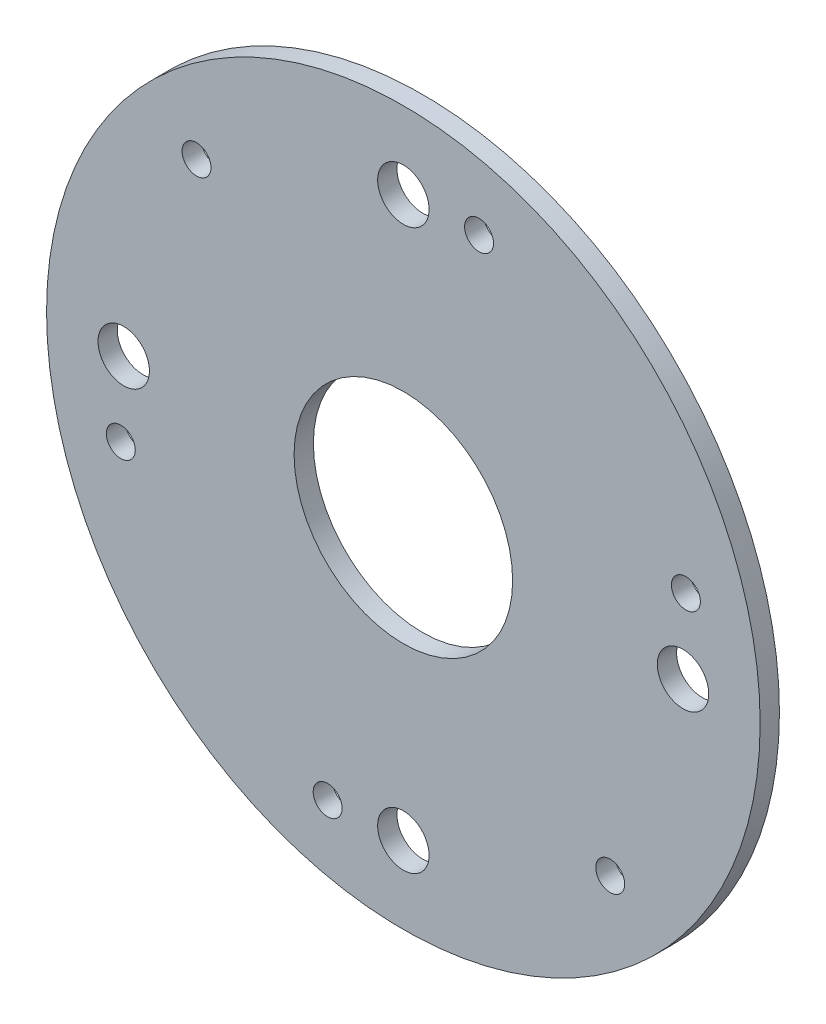
ISO-10303-21;
HEADER;
FILE_DESCRIPTION(('STEP AP214'),'2;1');
FILE_NAME('part.step','',(''),(''),'','','');
FILE_SCHEMA(('AUTOMOTIVE_DESIGN { 1 0 10303 214 1 1 1 1 }'));
ENDSEC;
DATA;
#1=APPLICATION_CONTEXT('core data for automotive mechanical design processes');
#2=APPLICATION_PROTOCOL_DEFINITION('international standard','automotive_design',2000,#1);
#3=PRODUCT_CONTEXT('',#1,'mechanical');
#4=PRODUCT('Part','Part','',(#3));
#5=PRODUCT_RELATED_PRODUCT_CATEGORY('part','',(#4));
#6=PRODUCT_DEFINITION_FORMATION('','',#4);
#7=PRODUCT_DEFINITION_CONTEXT('part definition',#1,'design');
#8=PRODUCT_DEFINITION('design','',#6,#7);
#9=PRODUCT_DEFINITION_SHAPE('','',#8);
#10=(LENGTH_UNIT() NAMED_UNIT(*) SI_UNIT(.MILLI.,.METRE.));
#11=(NAMED_UNIT(*) PLANE_ANGLE_UNIT() SI_UNIT($,.RADIAN.));
#12=(NAMED_UNIT(*) SI_UNIT($,.STERADIAN.) SOLID_ANGLE_UNIT());
#13=UNCERTAINTY_MEASURE_WITH_UNIT(LENGTH_MEASURE(1.E-05),#10,'distance_accuracy_value','');
#14=(GEOMETRIC_REPRESENTATION_CONTEXT(3) GLOBAL_UNCERTAINTY_ASSIGNED_CONTEXT((#13)) GLOBAL_UNIT_ASSIGNED_CONTEXT((#10,
#11,#12)) REPRESENTATION_CONTEXT('',''));
#15=CARTESIAN_POINT('',(0.,0.,0.));
#16=DIRECTION('',(0.,0.,1.));
#17=DIRECTION('',(1.,0.,0.));
#18=AXIS2_PLACEMENT_3D('',#15,#16,#17);
#19=CARTESIAN_POINT('',(0.,0.,47.5));
#20=DIRECTION('',(0.,0.,1.));
#21=DIRECTION('',(1.,0.,0.));
#22=AXIS2_PLACEMENT_3D('',#19,#20,#21);
#23=PLANE('',#22);
#24=CARTESIAN_POINT('',(43.5,0.,47.5));
#25=DIRECTION('',(0.,0.,1.));
#26=DIRECTION('',(1.,0.,0.));
#27=AXIS2_PLACEMENT_3D('',#24,#25,#26);
#28=CIRCLE('',#27,4.);
#29=CARTESIAN_POINT('',(47.5,0.,47.5));
#30=VERTEX_POINT('',#29);
#31=EDGE_CURVE('E64',#30,#30,#28,.T.);
#32=ORIENTED_EDGE('',*,*,#31,.F.);
#33=EDGE_LOOP('',(#32));
#34=FACE_BOUND('',#33,.T.);
#35=CARTESIAN_POINT('',(0.,43.5,47.5));
#36=DIRECTION('',(0.,0.,1.));
#37=DIRECTION('',(1.,0.,0.));
#38=AXIS2_PLACEMENT_3D('',#35,#36,#37);
#39=CIRCLE('',#38,4.);
#40=CARTESIAN_POINT('',(4.,43.5,47.5));
#41=VERTEX_POINT('',#40);
#42=EDGE_CURVE('E100',#41,#41,#39,.T.);
#43=ORIENTED_EDGE('',*,*,#42,.F.);
#44=EDGE_LOOP('',(#43));
#45=FACE_BOUND('',#44,.T.);
#46=CARTESIAN_POINT('',(-43.5,0.,47.5));
#47=DIRECTION('',(0.,0.,1.));
#48=DIRECTION('',(1.,0.,0.));
#49=AXIS2_PLACEMENT_3D('',#46,#47,#48);
#50=CIRCLE('',#49,4.);
#51=CARTESIAN_POINT('',(-39.5,0.,47.5));
#52=VERTEX_POINT('',#51);
#53=EDGE_CURVE('E96',#52,#52,#50,.T.);
#54=ORIENTED_EDGE('',*,*,#53,.F.);
#55=EDGE_LOOP('',(#54));
#56=FACE_BOUND('',#55,.T.);
#57=CARTESIAN_POINT('',(0.,-43.5,47.5));
#58=DIRECTION('',(0.,0.,1.));
#59=DIRECTION('',(1.,0.,0.));
#60=AXIS2_PLACEMENT_3D('',#57,#58,#59);
#61=CIRCLE('',#60,4.);
#62=CARTESIAN_POINT('',(3.99999999999999,-43.5,47.5));
#63=VERTEX_POINT('',#62);
#64=EDGE_CURVE('E92',#63,#63,#61,.T.);
#65=ORIENTED_EDGE('',*,*,#64,.F.);
#66=EDGE_LOOP('',(#65));
#67=FACE_BOUND('',#66,.T.);
#68=CARTESIAN_POINT('',(-11.7762665521647,-43.9496250961526,47.5));
#69=DIRECTION('',(0.,0.,1.));
#70=DIRECTION('',(1.,0.,0.));
#71=AXIS2_PLACEMENT_3D('',#68,#69,#70);
#72=CIRCLE('',#71,2.25);
#73=CARTESIAN_POINT('',(-9.52626655216473,-43.9496250961526,47.5));
#74=VERTEX_POINT('',#73);
#75=EDGE_CURVE('E87',#74,#74,#72,.T.);
#76=ORIENTED_EDGE('',*,*,#75,.F.);
#77=EDGE_LOOP('',(#76));
#78=FACE_BOUND('',#77,.T.);
#79=CARTESIAN_POINT('',(-43.9496250961526,-11.7762665521647,47.5));
#80=DIRECTION('',(0.,0.,1.));
#81=DIRECTION('',(1.,0.,0.));
#82=AXIS2_PLACEMENT_3D('',#79,#80,#81);
#83=CIRCLE('',#82,2.25);
#84=CARTESIAN_POINT('',(-41.6996250961526,-11.7762665521647,47.5));
#85=VERTEX_POINT('',#84);
#86=EDGE_CURVE('E83',#85,#85,#83,.T.);
#87=ORIENTED_EDGE('',*,*,#86,.F.);
#88=EDGE_LOOP('',(#87));
#89=FACE_BOUND('',#88,.T.);
#90=CARTESIAN_POINT('',(-32.1733585439879,32.1733585439879,47.5));
#91=DIRECTION('',(0.,0.,1.));
#92=DIRECTION('',(1.,0.,0.));
#93=AXIS2_PLACEMENT_3D('',#90,#91,#92);
#94=CIRCLE('',#93,2.25);
#95=CARTESIAN_POINT('',(-29.9233585439879,32.1733585439879,47.5));
#96=VERTEX_POINT('',#95);
#97=EDGE_CURVE('E78',#96,#96,#94,.T.);
#98=ORIENTED_EDGE('',*,*,#97,.F.);
#99=EDGE_LOOP('',(#98));
#100=FACE_BOUND('',#99,.T.);
#101=CARTESIAN_POINT('',(11.7762665521647,43.9496250961526,47.5));
#102=DIRECTION('',(0.,0.,1.));
#103=DIRECTION('',(1.,0.,0.));
#104=AXIS2_PLACEMENT_3D('',#101,#102,#103);
#105=CIRCLE('',#104,2.25);
#106=CARTESIAN_POINT('',(14.0262665521647,43.9496250961526,47.5));
#107=VERTEX_POINT('',#106);
#108=EDGE_CURVE('E73',#107,#107,#105,.T.);
#109=ORIENTED_EDGE('',*,*,#108,.F.);
#110=EDGE_LOOP('',(#109));
#111=FACE_BOUND('',#110,.T.);
#112=CARTESIAN_POINT('',(43.9496250961526,11.7762665521647,47.5));
#113=DIRECTION('',(0.,0.,1.));
#114=DIRECTION('',(1.,0.,0.));
#115=AXIS2_PLACEMENT_3D('',#112,#113,#114);
#116=CIRCLE('',#115,2.25);
#117=CARTESIAN_POINT('',(46.1996250961526,11.7762665521647,47.5));
#118=VERTEX_POINT('',#117);
#119=EDGE_CURVE('E69',#118,#118,#116,.T.);
#120=ORIENTED_EDGE('',*,*,#119,.F.);
#121=EDGE_LOOP('',(#120));
#122=FACE_BOUND('',#121,.T.);
#123=CARTESIAN_POINT('',(32.1733585439879,-32.1733585439879,47.5));
#124=DIRECTION('',(0.,0.,1.));
#125=DIRECTION('',(1.,0.,0.));
#126=AXIS2_PLACEMENT_3D('',#123,#124,#125);
#127=CIRCLE('',#126,2.25);
#128=CARTESIAN_POINT('',(34.4233585439879,-32.1733585439879,47.5));
#129=VERTEX_POINT('',#128);
#130=EDGE_CURVE('E63',#129,#129,#127,.T.);
#131=ORIENTED_EDGE('',*,*,#130,.F.);
#132=EDGE_LOOP('',(#131));
#133=FACE_BOUND('',#132,.T.);
#134=CARTESIAN_POINT('',(0.,0.,47.5));
#135=DIRECTION('',(0.,0.,1.));
#136=DIRECTION('',(1.,0.,0.));
#137=AXIS2_PLACEMENT_3D('',#134,#135,#136);
#138=CIRCLE('',#137,55.5);
#139=CARTESIAN_POINT('',(55.5,0.,47.5));
#140=VERTEX_POINT('',#139);
#141=EDGE_CURVE('E10',#140,#140,#138,.T.);
#142=ORIENTED_EDGE('',*,*,#141,.T.);
#143=EDGE_LOOP('',(#142));
#144=FACE_BOUND('',#143,.T.);
#145=CARTESIAN_POINT('',(0.,0.,47.5));
#146=DIRECTION('',(0.,0.,1.));
#147=DIRECTION('',(1.,0.,0.));
#148=AXIS2_PLACEMENT_3D('',#145,#146,#147);
#149=CIRCLE('',#148,17.);
#150=CARTESIAN_POINT('',(17.,0.,47.5));
#151=VERTEX_POINT('',#150);
#152=EDGE_CURVE('E53',#151,#151,#149,.T.);
#153=ORIENTED_EDGE('',*,*,#152,.F.);
#154=EDGE_LOOP('',(#153));
#155=FACE_BOUND('',#154,.T.);
#156=ADVANCED_FACE('F36',(#34,#45,#56,#67,#78,#89,#100,#111,#122,#133,#144,#155),#23,.T.);
#157=CARTESIAN_POINT('',(0.,0.,44.5));
#158=DIRECTION('',(0.,0.,1.));
#159=DIRECTION('',(1.,0.,0.));
#160=AXIS2_PLACEMENT_3D('',#157,#158,#159);
#161=PLANE('',#160);
#162=CARTESIAN_POINT('',(43.5,0.,44.5));
#163=DIRECTION('',(0.,0.,1.));
#164=DIRECTION('',(1.,0.,0.));
#165=AXIS2_PLACEMENT_3D('',#162,#163,#164);
#166=CIRCLE('',#165,4.);
#167=CARTESIAN_POINT('',(47.5,0.,44.5));
#168=VERTEX_POINT('',#167);
#169=EDGE_CURVE('E40',#168,#168,#166,.T.);
#170=ORIENTED_EDGE('',*,*,#169,.T.);
#171=EDGE_LOOP('',(#170));
#172=FACE_BOUND('',#171,.T.);
#173=CARTESIAN_POINT('',(0.,43.5,44.5));
#174=DIRECTION('',(0.,0.,1.));
#175=DIRECTION('',(1.,0.,0.));
#176=AXIS2_PLACEMENT_3D('',#173,#174,#175);
#177=CIRCLE('',#176,4.);
#178=CARTESIAN_POINT('',(4.,43.5,44.5));
#179=VERTEX_POINT('',#178);
#180=EDGE_CURVE('E97',#179,#179,#177,.T.);
#181=ORIENTED_EDGE('',*,*,#180,.T.);
#182=EDGE_LOOP('',(#181));
#183=FACE_BOUND('',#182,.T.);
#184=CARTESIAN_POINT('',(-43.5,0.,44.5));
#185=DIRECTION('',(0.,0.,1.));
#186=DIRECTION('',(1.,0.,0.));
#187=AXIS2_PLACEMENT_3D('',#184,#185,#186);
#188=CIRCLE('',#187,4.);
#189=CARTESIAN_POINT('',(-39.5,0.,44.5));
#190=VERTEX_POINT('',#189);
#191=EDGE_CURVE('E93',#190,#190,#188,.T.);
#192=ORIENTED_EDGE('',*,*,#191,.T.);
#193=EDGE_LOOP('',(#192));
#194=FACE_BOUND('',#193,.T.);
#195=CARTESIAN_POINT('',(0.,-43.5,44.5));
#196=DIRECTION('',(0.,0.,1.));
#197=DIRECTION('',(1.,0.,0.));
#198=AXIS2_PLACEMENT_3D('',#195,#196,#197);
#199=CIRCLE('',#198,4.);
#200=CARTESIAN_POINT('',(3.99999999999999,-43.5,44.5));
#201=VERTEX_POINT('',#200);
#202=EDGE_CURVE('E88',#201,#201,#199,.T.);
#203=ORIENTED_EDGE('',*,*,#202,.T.);
#204=EDGE_LOOP('',(#203));
#205=FACE_BOUND('',#204,.T.);
#206=CARTESIAN_POINT('',(-11.7762665521647,-43.9496250961526,44.5));
#207=DIRECTION('',(0.,0.,1.));
#208=DIRECTION('',(1.,0.,0.));
#209=AXIS2_PLACEMENT_3D('',#206,#207,#208);
#210=CIRCLE('',#209,2.25);
#211=CARTESIAN_POINT('',(-9.52626655216473,-43.9496250961526,44.5));
#212=VERTEX_POINT('',#211);
#213=EDGE_CURVE('E84',#212,#212,#210,.T.);
#214=ORIENTED_EDGE('',*,*,#213,.T.);
#215=EDGE_LOOP('',(#214));
#216=FACE_BOUND('',#215,.T.);
#217=CARTESIAN_POINT('',(-43.9496250961526,-11.7762665521647,44.5));
#218=DIRECTION('',(0.,0.,1.));
#219=DIRECTION('',(1.,0.,0.));
#220=AXIS2_PLACEMENT_3D('',#217,#218,#219);
#221=CIRCLE('',#220,2.25);
#222=CARTESIAN_POINT('',(-41.6996250961526,-11.7762665521647,44.5));
#223=VERTEX_POINT('',#222);
#224=EDGE_CURVE('E79',#223,#223,#221,.T.);
#225=ORIENTED_EDGE('',*,*,#224,.T.);
#226=EDGE_LOOP('',(#225));
#227=FACE_BOUND('',#226,.T.);
#228=CARTESIAN_POINT('',(-32.1733585439879,32.1733585439879,44.5));
#229=DIRECTION('',(0.,0.,1.));
#230=DIRECTION('',(1.,0.,0.));
#231=AXIS2_PLACEMENT_3D('',#228,#229,#230);
#232=CIRCLE('',#231,2.25);
#233=CARTESIAN_POINT('',(-29.9233585439879,32.1733585439879,44.5));
#234=VERTEX_POINT('',#233);
#235=EDGE_CURVE('E74',#234,#234,#232,.T.);
#236=ORIENTED_EDGE('',*,*,#235,.T.);
#237=EDGE_LOOP('',(#236));
#238=FACE_BOUND('',#237,.T.);
#239=CARTESIAN_POINT('',(11.7762665521647,43.9496250961526,44.5));
#240=DIRECTION('',(0.,0.,1.));
#241=DIRECTION('',(1.,0.,0.));
#242=AXIS2_PLACEMENT_3D('',#239,#240,#241);
#243=CIRCLE('',#242,2.25);
#244=CARTESIAN_POINT('',(14.0262665521647,43.9496250961526,44.5));
#245=VERTEX_POINT('',#244);
#246=EDGE_CURVE('E70',#245,#245,#243,.T.);
#247=ORIENTED_EDGE('',*,*,#246,.T.);
#248=EDGE_LOOP('',(#247));
#249=FACE_BOUND('',#248,.T.);
#250=CARTESIAN_POINT('',(43.9496250961526,11.7762665521647,44.5));
#251=DIRECTION('',(0.,0.,1.));
#252=DIRECTION('',(1.,0.,0.));
#253=AXIS2_PLACEMENT_3D('',#250,#251,#252);
#254=CIRCLE('',#253,2.25);
#255=CARTESIAN_POINT('',(46.1996250961526,11.7762665521647,44.5));
#256=VERTEX_POINT('',#255);
#257=EDGE_CURVE('E65',#256,#256,#254,.T.);
#258=ORIENTED_EDGE('',*,*,#257,.T.);
#259=EDGE_LOOP('',(#258));
#260=FACE_BOUND('',#259,.T.);
#261=CARTESIAN_POINT('',(32.1733585439879,-32.1733585439879,44.5));
#262=DIRECTION('',(0.,0.,1.));
#263=DIRECTION('',(1.,0.,0.));
#264=AXIS2_PLACEMENT_3D('',#261,#262,#263);
#265=CIRCLE('',#264,2.25);
#266=CARTESIAN_POINT('',(34.4233585439879,-32.1733585439879,44.5));
#267=VERTEX_POINT('',#266);
#268=EDGE_CURVE('E59',#267,#267,#265,.T.);
#269=ORIENTED_EDGE('',*,*,#268,.T.);
#270=EDGE_LOOP('',(#269));
#271=FACE_BOUND('',#270,.T.);
#272=CARTESIAN_POINT('',(0.,0.,44.5));
#273=DIRECTION('',(0.,0.,1.));
#274=DIRECTION('',(1.,0.,0.));
#275=AXIS2_PLACEMENT_3D('',#272,#273,#274);
#276=CIRCLE('',#275,55.5);
#277=CARTESIAN_POINT('',(55.5,0.,44.5));
#278=VERTEX_POINT('',#277);
#279=EDGE_CURVE('E45',#278,#278,#276,.T.);
#280=ORIENTED_EDGE('',*,*,#279,.F.);
#281=EDGE_LOOP('',(#280));
#282=FACE_BOUND('',#281,.T.);
#283=CARTESIAN_POINT('',(0.,0.,44.5));
#284=DIRECTION('',(0.,0.,1.));
#285=DIRECTION('',(1.,0.,0.));
#286=AXIS2_PLACEMENT_3D('',#283,#284,#285);
#287=CIRCLE('',#286,17.);
#288=CARTESIAN_POINT('',(17.,0.,44.5));
#289=VERTEX_POINT('',#288);
#290=EDGE_CURVE('E56',#289,#289,#287,.T.);
#291=ORIENTED_EDGE('',*,*,#290,.T.);
#292=EDGE_LOOP('',(#291));
#293=FACE_BOUND('',#292,.T.);
#294=ADVANCED_FACE('F141',(#172,#183,#194,#205,#216,#227,#238,#249,#260,#271,#282,#293),#161,.F.);
#295=CARTESIAN_POINT('',(0.,0.,47.5));
#296=DIRECTION('',(0.,0.,-1.));
#297=DIRECTION('',(-1.,0.,0.));
#298=AXIS2_PLACEMENT_3D('',#295,#296,#297);
#299=CYLINDRICAL_SURFACE('',#298,55.5);
#300=ORIENTED_EDGE('',*,*,#141,.F.);
#301=EDGE_LOOP('',(#300));
#302=FACE_BOUND('',#301,.T.);
#303=ORIENTED_EDGE('',*,*,#279,.T.);
#304=EDGE_LOOP('',(#303));
#305=FACE_BOUND('',#304,.T.);
#306=ADVANCED_FACE('F38',(#302,#305),#299,.T.);
#307=CARTESIAN_POINT('',(0.,0.,47.5));
#308=DIRECTION('',(0.,0.,-1.));
#309=DIRECTION('',(-1.,0.,0.));
#310=AXIS2_PLACEMENT_3D('',#307,#308,#309);
#311=CYLINDRICAL_SURFACE('',#310,17.);
#312=ORIENTED_EDGE('',*,*,#152,.T.);
#313=EDGE_LOOP('',(#312));
#314=FACE_BOUND('',#313,.T.);
#315=ORIENTED_EDGE('',*,*,#290,.F.);
#316=EDGE_LOOP('',(#315));
#317=FACE_BOUND('',#316,.T.);
#318=ADVANCED_FACE('F143',(#314,#317),#311,.F.);
#319=CARTESIAN_POINT('',(32.1733585439879,-32.1733585439879,-100.));
#320=DIRECTION('',(0.,0.,1.));
#321=DIRECTION('',(1.,0.,0.));
#322=AXIS2_PLACEMENT_3D('',#319,#320,#321);
#323=CYLINDRICAL_SURFACE('',#322,2.25);
#324=ORIENTED_EDGE('',*,*,#130,.T.);
#325=EDGE_LOOP('',(#324));
#326=FACE_BOUND('',#325,.T.);
#327=ORIENTED_EDGE('',*,*,#268,.F.);
#328=EDGE_LOOP('',(#327));
#329=FACE_BOUND('',#328,.T.);
#330=ADVANCED_FACE('F145',(#326,#329),#323,.F.);
#331=CARTESIAN_POINT('',(43.9496250961526,11.7762665521647,-100.));
#332=DIRECTION('',(0.,0.,1.));
#333=DIRECTION('',(1.,0.,0.));
#334=AXIS2_PLACEMENT_3D('',#331,#332,#333);
#335=CYLINDRICAL_SURFACE('',#334,2.25);
#336=ORIENTED_EDGE('',*,*,#119,.T.);
#337=EDGE_LOOP('',(#336));
#338=FACE_BOUND('',#337,.T.);
#339=ORIENTED_EDGE('',*,*,#257,.F.);
#340=EDGE_LOOP('',(#339));
#341=FACE_BOUND('',#340,.T.);
#342=ADVANCED_FACE('F151',(#338,#341),#335,.F.);
#343=CARTESIAN_POINT('',(11.7762665521647,43.9496250961526,-100.));
#344=DIRECTION('',(0.,0.,1.));
#345=DIRECTION('',(1.,0.,0.));
#346=AXIS2_PLACEMENT_3D('',#343,#344,#345);
#347=CYLINDRICAL_SURFACE('',#346,2.25);
#348=ORIENTED_EDGE('',*,*,#108,.T.);
#349=EDGE_LOOP('',(#348));
#350=FACE_BOUND('',#349,.T.);
#351=ORIENTED_EDGE('',*,*,#246,.F.);
#352=EDGE_LOOP('',(#351));
#353=FACE_BOUND('',#352,.T.);
#354=ADVANCED_FACE('F192',(#350,#353),#347,.F.);
#355=CARTESIAN_POINT('',(-32.1733585439879,32.1733585439879,-100.));
#356=DIRECTION('',(0.,0.,1.));
#357=DIRECTION('',(1.,0.,0.));
#358=AXIS2_PLACEMENT_3D('',#355,#356,#357);
#359=CYLINDRICAL_SURFACE('',#358,2.25);
#360=ORIENTED_EDGE('',*,*,#97,.T.);
#361=EDGE_LOOP('',(#360));
#362=FACE_BOUND('',#361,.T.);
#363=ORIENTED_EDGE('',*,*,#235,.F.);
#364=EDGE_LOOP('',(#363));
#365=FACE_BOUND('',#364,.T.);
#366=ADVANCED_FACE('F198',(#362,#365),#359,.F.);
#367=CARTESIAN_POINT('',(-43.9496250961526,-11.7762665521647,-100.));
#368=DIRECTION('',(0.,0.,1.));
#369=DIRECTION('',(1.,0.,0.));
#370=AXIS2_PLACEMENT_3D('',#367,#368,#369);
#371=CYLINDRICAL_SURFACE('',#370,2.25);
#372=ORIENTED_EDGE('',*,*,#86,.T.);
#373=EDGE_LOOP('',(#372));
#374=FACE_BOUND('',#373,.T.);
#375=ORIENTED_EDGE('',*,*,#224,.F.);
#376=EDGE_LOOP('',(#375));
#377=FACE_BOUND('',#376,.T.);
#378=ADVANCED_FACE('F206',(#374,#377),#371,.F.);
#379=CARTESIAN_POINT('',(-11.7762665521647,-43.9496250961526,-100.));
#380=DIRECTION('',(0.,0.,1.));
#381=DIRECTION('',(1.,0.,0.));
#382=AXIS2_PLACEMENT_3D('',#379,#380,#381);
#383=CYLINDRICAL_SURFACE('',#382,2.25);
#384=ORIENTED_EDGE('',*,*,#75,.T.);
#385=EDGE_LOOP('',(#384));
#386=FACE_BOUND('',#385,.T.);
#387=ORIENTED_EDGE('',*,*,#213,.F.);
#388=EDGE_LOOP('',(#387));
#389=FACE_BOUND('',#388,.T.);
#390=ADVANCED_FACE('F202',(#386,#389),#383,.F.);
#391=CARTESIAN_POINT('',(0.,-43.5,-100.));
#392=DIRECTION('',(0.,0.,1.));
#393=DIRECTION('',(1.,0.,0.));
#394=AXIS2_PLACEMENT_3D('',#391,#392,#393);
#395=CYLINDRICAL_SURFACE('',#394,4.);
#396=ORIENTED_EDGE('',*,*,#64,.T.);
#397=EDGE_LOOP('',(#396));
#398=FACE_BOUND('',#397,.T.);
#399=ORIENTED_EDGE('',*,*,#202,.F.);
#400=EDGE_LOOP('',(#399));
#401=FACE_BOUND('',#400,.T.);
#402=ADVANCED_FACE('F205',(#398,#401),#395,.F.);
#403=CARTESIAN_POINT('',(-43.5,0.,-100.));
#404=DIRECTION('',(0.,0.,1.));
#405=DIRECTION('',(1.,0.,0.));
#406=AXIS2_PLACEMENT_3D('',#403,#404,#405);
#407=CYLINDRICAL_SURFACE('',#406,4.);
#408=ORIENTED_EDGE('',*,*,#53,.T.);
#409=EDGE_LOOP('',(#408));
#410=FACE_BOUND('',#409,.T.);
#411=ORIENTED_EDGE('',*,*,#191,.F.);
#412=EDGE_LOOP('',(#411));
#413=FACE_BOUND('',#412,.T.);
#414=ADVANCED_FACE('F216',(#410,#413),#407,.F.);
#415=CARTESIAN_POINT('',(0.,43.5,-100.));
#416=DIRECTION('',(0.,0.,1.));
#417=DIRECTION('',(1.,0.,0.));
#418=AXIS2_PLACEMENT_3D('',#415,#416,#417);
#419=CYLINDRICAL_SURFACE('',#418,4.);
#420=ORIENTED_EDGE('',*,*,#42,.T.);
#421=EDGE_LOOP('',(#420));
#422=FACE_BOUND('',#421,.T.);
#423=ORIENTED_EDGE('',*,*,#180,.F.);
#424=EDGE_LOOP('',(#423));
#425=FACE_BOUND('',#424,.T.);
#426=ADVANCED_FACE('F220',(#422,#425),#419,.F.);
#427=CARTESIAN_POINT('',(43.5,0.,-100.));
#428=DIRECTION('',(0.,0.,1.));
#429=DIRECTION('',(1.,0.,0.));
#430=AXIS2_PLACEMENT_3D('',#427,#428,#429);
#431=CYLINDRICAL_SURFACE('',#430,4.);
#432=ORIENTED_EDGE('',*,*,#31,.T.);
#433=EDGE_LOOP('',(#432));
#434=FACE_BOUND('',#433,.T.);
#435=ORIENTED_EDGE('',*,*,#169,.F.);
#436=EDGE_LOOP('',(#435));
#437=FACE_BOUND('',#436,.T.);
#438=ADVANCED_FACE('F223',(#434,#437),#431,.F.);
#439=CLOSED_SHELL('',(#156,#294,#306,#318,#330,#342,#354,#366,#378,#390,#402,#414,#426,#438));
#440=MANIFOLD_SOLID_BREP('B2',#439);
#441=ADVANCED_BREP_SHAPE_REPRESENTATION('',(#18,#440),#14);
#442=SHAPE_DEFINITION_REPRESENTATION(#9,#441);
ENDSEC;
END-ISO-10303-21;
